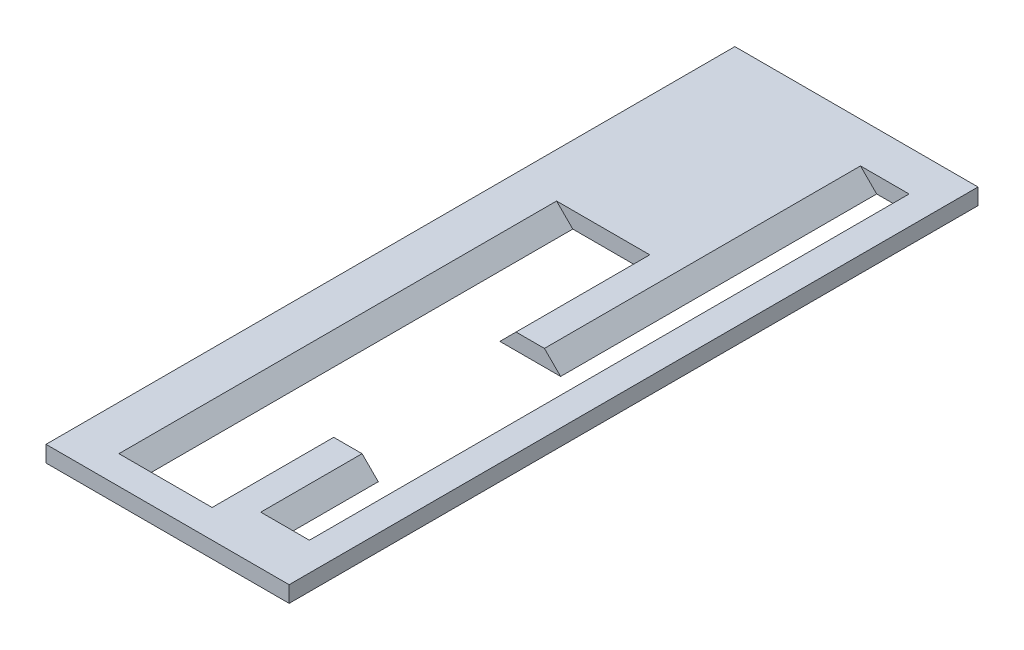
ISO-10303-21;
HEADER;
FILE_DESCRIPTION(('STEP AP214'),'2;1');
FILE_NAME('part.step','',(''),(''),'','','');
FILE_SCHEMA(('AUTOMOTIVE_DESIGN { 1 0 10303 214 1 1 1 1 }'));
ENDSEC;
DATA;
#1=APPLICATION_CONTEXT('core data for automotive mechanical design processes');
#2=APPLICATION_PROTOCOL_DEFINITION('international standard','automotive_design',2000,#1);
#3=PRODUCT_CONTEXT('',#1,'mechanical');
#4=PRODUCT('Part','Part','',(#3));
#5=PRODUCT_RELATED_PRODUCT_CATEGORY('part','',(#4));
#6=PRODUCT_DEFINITION_FORMATION('','',#4);
#7=PRODUCT_DEFINITION_CONTEXT('part definition',#1,'design');
#8=PRODUCT_DEFINITION('design','',#6,#7);
#9=PRODUCT_DEFINITION_SHAPE('','',#8);
#10=(LENGTH_UNIT() NAMED_UNIT(*) SI_UNIT(.MILLI.,.METRE.));
#11=(NAMED_UNIT(*) PLANE_ANGLE_UNIT() SI_UNIT($,.RADIAN.));
#12=(NAMED_UNIT(*) SI_UNIT($,.STERADIAN.) SOLID_ANGLE_UNIT());
#13=UNCERTAINTY_MEASURE_WITH_UNIT(LENGTH_MEASURE(1.E-05),#10,'distance_accuracy_value','');
#14=(GEOMETRIC_REPRESENTATION_CONTEXT(3) GLOBAL_UNCERTAINTY_ASSIGNED_CONTEXT((#13)) GLOBAL_UNIT_ASSIGNED_CONTEXT((#10,
#11,#12)) REPRESENTATION_CONTEXT('',''));
#15=CARTESIAN_POINT('',(0.,0.,0.));
#16=DIRECTION('',(0.,0.,1.));
#17=DIRECTION('',(1.,0.,0.));
#18=AXIS2_PLACEMENT_3D('',#15,#16,#17);
#19=CARTESIAN_POINT('',(4.75000000000001,-4.75,-110.));
#20=DIRECTION('',(-0.707106781186549,0.707106781186546,0.));
#21=DIRECTION('',(-0.707106781186546,-0.707106781186549,0.));
#22=AXIS2_PLACEMENT_3D('',#19,#20,#21);
#23=PLANE('',#22);
#24=DIRECTION('',(0.,0.,1.));
#25=VECTOR('',#24,1.);
#26=CARTESIAN_POINT('',(11.5,2.,-110.));
#27=LINE('',#26,#25);
#28=CARTESIAN_POINT('',(11.5,2.,-32.));
#29=VERTEX_POINT('',#28);
#30=CARTESIAN_POINT('',(11.5,2.,-2.));
#31=VERTEX_POINT('',#30);
#32=EDGE_CURVE('E208',#29,#31,#27,.T.);
#33=ORIENTED_EDGE('',*,*,#32,.F.);
#34=DIRECTION('',(-0.707106781186546,-0.707106781186549,0.));
#35=VECTOR('',#34,1.);
#36=CARTESIAN_POINT('',(4.75000000000001,-4.75,-32.));
#37=LINE('',#36,#35);
#38=CARTESIAN_POINT('',(7.5,-2.,-32.));
#39=VERTEX_POINT('',#38);
#40=EDGE_CURVE('E295',#29,#39,#37,.T.);
#41=ORIENTED_EDGE('',*,*,#40,.T.);
#42=DIRECTION('',(0.,0.,1.));
#43=VECTOR('',#42,1.);
#44=CARTESIAN_POINT('',(7.5,-2.,-110.));
#45=LINE('',#44,#43);
#46=CARTESIAN_POINT('',(7.49999999999999,-2.,-2.));
#47=VERTEX_POINT('',#46);
#48=EDGE_CURVE('E169',#39,#47,#45,.T.);
#49=ORIENTED_EDGE('',*,*,#48,.T.);
#50=DIRECTION('',(-0.707106781186546,-0.707106781186549,0.));
#51=VECTOR('',#50,1.);
#52=CARTESIAN_POINT('',(11.5,2.,-2.));
#53=LINE('',#52,#51);
#54=EDGE_CURVE('E289',#31,#47,#53,.T.);
#55=ORIENTED_EDGE('',*,*,#54,.F.);
#56=EDGE_LOOP('',(#33,#41,#49,#55));
#57=FACE_BOUND('',#56,.T.);
#58=ADVANCED_FACE('F43',(#57),#23,.T.);
#59=CARTESIAN_POINT('',(0.,2.,-110.));
#60=DIRECTION('',(0.,-1.,0.));
#61=DIRECTION('',(0.,0.,-1.));
#62=AXIS2_PLACEMENT_3D('',#59,#60,#61);
#63=PLANE('',#62);
#64=DIRECTION('',(-1.,0.,0.));
#65=VECTOR('',#64,1.);
#66=CARTESIAN_POINT('',(-22.5,2.,5.));
#67=LINE('',#66,#65);
#68=CARTESIAN_POINT('',(37.5,2.,5.));
#69=VERTEX_POINT('',#68);
#70=CARTESIAN_POINT('',(-22.5,2.,5.));
#71=VERTEX_POINT('',#70);
#72=EDGE_CURVE('E216',#69,#71,#67,.T.);
#73=ORIENTED_EDGE('',*,*,#72,.F.);
#74=DIRECTION('',(0.,0.,-1.));
#75=VECTOR('',#74,1.);
#76=CARTESIAN_POINT('',(37.5,2.,0.));
#77=LINE('',#76,#75);
#78=CARTESIAN_POINT('',(37.5,2.,-165.));
#79=VERTEX_POINT('',#78);
#80=EDGE_CURVE('E189',#69,#79,#77,.T.);
#81=ORIENTED_EDGE('',*,*,#80,.T.);
#82=DIRECTION('',(-1.,0.,0.));
#83=VECTOR('',#82,1.);
#84=CARTESIAN_POINT('',(0.,2.,-165.));
#85=LINE('',#84,#83);
#86=CARTESIAN_POINT('',(-22.5,2.,-165.));
#87=VERTEX_POINT('',#86);
#88=EDGE_CURVE('E186',#79,#87,#85,.T.);
#89=ORIENTED_EDGE('',*,*,#88,.T.);
#90=DIRECTION('',(0.,0.,1.));
#91=VECTOR('',#90,1.);
#92=CARTESIAN_POINT('',(-22.5,2.,-110.));
#93=LINE('',#92,#91);
#94=EDGE_CURVE('E228',#87,#71,#93,.T.);
#95=ORIENTED_EDGE('',*,*,#94,.T.);
#96=EDGE_LOOP('',(#73,#81,#89,#95));
#97=FACE_BOUND('',#96,.T.);
#98=CARTESIAN_POINT('',(11.5,2.,-110.));
#99=VERTEX_POINT('',#98);
#100=CARTESIAN_POINT('',(11.5,2.,-77.));
#101=VERTEX_POINT('',#100);
#102=EDGE_CURVE('E213',#99,#101,#27,.T.);
#103=ORIENTED_EDGE('',*,*,#102,.T.);
#104=DIRECTION('',(1.,0.,0.));
#105=VECTOR('',#104,1.);
#106=CARTESIAN_POINT('',(0.,2.,-77.));
#107=LINE('',#106,#105);
#108=CARTESIAN_POINT('',(18.5,2.,-77.));
#109=VERTEX_POINT('',#108);
#110=EDGE_CURVE('E170',#101,#109,#107,.T.);
#111=ORIENTED_EDGE('',*,*,#110,.T.);
#112=DIRECTION('',(0.,0.,-1.));
#113=VECTOR('',#112,1.);
#114=CARTESIAN_POINT('',(18.5,2.,-110.));
#115=LINE('',#114,#113);
#116=CARTESIAN_POINT('',(18.5,2.,-155.));
#117=VERTEX_POINT('',#116);
#118=EDGE_CURVE('E248',#109,#117,#115,.T.);
#119=ORIENTED_EDGE('',*,*,#118,.T.);
#120=DIRECTION('',(-1.,0.,0.));
#121=VECTOR('',#120,1.);
#122=CARTESIAN_POINT('',(22.5,2.,-155.));
#123=LINE('',#122,#121);
#124=CARTESIAN_POINT('',(30.5000000000001,2.,-155.));
#125=VERTEX_POINT('',#124);
#126=EDGE_CURVE('E182',#125,#117,#123,.T.);
#127=ORIENTED_EDGE('',*,*,#126,.F.);
#128=DIRECTION('',(0.,0.,1.));
#129=VECTOR('',#128,1.);
#130=CARTESIAN_POINT('',(30.5000000000001,2.,-110.));
#131=LINE('',#130,#129);
#132=CARTESIAN_POINT('',(30.5000000000001,2.,-7.));
#133=VERTEX_POINT('',#132);
#134=EDGE_CURVE('E245',#125,#133,#131,.T.);
#135=ORIENTED_EDGE('',*,*,#134,.T.);
#136=DIRECTION('',(1.,0.,0.));
#137=VECTOR('',#136,1.);
#138=CARTESIAN_POINT('',(22.5,2.,-7.));
#139=LINE('',#138,#137);
#140=CARTESIAN_POINT('',(18.5,2.,-7.));
#141=VERTEX_POINT('',#140);
#142=EDGE_CURVE('E282',#141,#133,#139,.T.);
#143=ORIENTED_EDGE('',*,*,#142,.F.);
#144=DIRECTION('',(0.,0.,-1.));
#145=VECTOR('',#144,1.);
#146=CARTESIAN_POINT('',(18.5,2.,-110.));
#147=LINE('',#146,#145);
#148=CARTESIAN_POINT('',(18.5,2.,-32.));
#149=VERTEX_POINT('',#148);
#150=EDGE_CURVE('E250',#141,#149,#147,.T.);
#151=ORIENTED_EDGE('',*,*,#150,.T.);
#152=DIRECTION('',(1.,0.,0.));
#153=VECTOR('',#152,1.);
#154=CARTESIAN_POINT('',(0.,2.,-32.));
#155=LINE('',#154,#153);
#156=EDGE_CURVE('E59',#29,#149,#155,.T.);
#157=ORIENTED_EDGE('',*,*,#156,.F.);
#158=ORIENTED_EDGE('',*,*,#32,.T.);
#159=DIRECTION('',(1.,0.,0.));
#160=VECTOR('',#159,1.);
#161=CARTESIAN_POINT('',(-11.5,2.,-2.));
#162=LINE('',#161,#160);
#163=CARTESIAN_POINT('',(-11.5,2.,-2.));
#164=VERTEX_POINT('',#163);
#165=EDGE_CURVE('E292',#164,#31,#162,.T.);
#166=ORIENTED_EDGE('',*,*,#165,.F.);
#167=DIRECTION('',(0.,0.,1.));
#168=VECTOR('',#167,1.);
#169=CARTESIAN_POINT('',(-11.5,2.,-110.));
#170=LINE('',#169,#168);
#171=CARTESIAN_POINT('',(-11.5,2.,-110.));
#172=VERTEX_POINT('',#171);
#173=EDGE_CURVE('E231',#172,#164,#170,.T.);
#174=ORIENTED_EDGE('',*,*,#173,.F.);
#175=DIRECTION('',(-1.,0.,0.));
#176=VECTOR('',#175,1.);
#177=CARTESIAN_POINT('',(-22.5,2.,-110.));
#178=LINE('',#177,#176);
#179=EDGE_CURVE('E196',#99,#172,#178,.T.);
#180=ORIENTED_EDGE('',*,*,#179,.F.);
#181=EDGE_LOOP('',(#103,#111,#119,#127,#135,#143,#151,#157,#158,#166,#174,#180));
#182=FACE_BOUND('',#181,.T.);
#183=ADVANCED_FACE('F267',(#97,#182),#63,.F.);
#184=CARTESIAN_POINT('',(0.,-2.,-110.));
#185=DIRECTION('',(0.,-1.,0.));
#186=DIRECTION('',(0.,0.,-1.));
#187=AXIS2_PLACEMENT_3D('',#184,#185,#186);
#188=PLANE('',#187);
#189=DIRECTION('',(1.,0.,0.));
#190=VECTOR('',#189,1.);
#191=CARTESIAN_POINT('',(7.50000000000001,-2.,-77.));
#192=LINE('',#191,#190);
#193=CARTESIAN_POINT('',(7.50000000000001,-2.,-77.));
#194=VERTEX_POINT('',#193);
#195=CARTESIAN_POINT('',(22.5,-2.,-77.));
#196=VERTEX_POINT('',#195);
#197=EDGE_CURVE('E66',#194,#196,#192,.T.);
#198=ORIENTED_EDGE('',*,*,#197,.F.);
#199=CARTESIAN_POINT('',(7.49999999999999,-2.,-110.));
#200=VERTEX_POINT('',#199);
#201=EDGE_CURVE('E209',#200,#194,#45,.T.);
#202=ORIENTED_EDGE('',*,*,#201,.F.);
#203=DIRECTION('',(-1.,0.,0.));
#204=VECTOR('',#203,1.);
#205=CARTESIAN_POINT('',(-22.5,-2.,-110.));
#206=LINE('',#205,#204);
#207=CARTESIAN_POINT('',(-7.5,-2.,-110.));
#208=VERTEX_POINT('',#207);
#209=EDGE_CURVE('E202',#200,#208,#206,.T.);
#210=ORIENTED_EDGE('',*,*,#209,.T.);
#211=DIRECTION('',(0.,0.,1.));
#212=VECTOR('',#211,1.);
#213=CARTESIAN_POINT('',(-7.5,-2.,-110.));
#214=LINE('',#213,#212);
#215=CARTESIAN_POINT('',(-7.5,-2.,-2.));
#216=VERTEX_POINT('',#215);
#217=EDGE_CURVE('E234',#208,#216,#214,.T.);
#218=ORIENTED_EDGE('',*,*,#217,.T.);
#219=DIRECTION('',(-1.,0.,0.));
#220=VECTOR('',#219,1.);
#221=CARTESIAN_POINT('',(7.49999999999999,-2.,-2.));
#222=LINE('',#221,#220);
#223=EDGE_CURVE('E285',#47,#216,#222,.T.);
#224=ORIENTED_EDGE('',*,*,#223,.F.);
#225=ORIENTED_EDGE('',*,*,#48,.F.);
#226=DIRECTION('',(1.,0.,0.));
#227=VECTOR('',#226,1.);
#228=CARTESIAN_POINT('',(7.5,-2.,-32.));
#229=LINE('',#228,#227);
#230=CARTESIAN_POINT('',(22.5,-2.,-32.));
#231=VERTEX_POINT('',#230);
#232=EDGE_CURVE('E155',#39,#231,#229,.T.);
#233=ORIENTED_EDGE('',*,*,#232,.T.);
#234=DIRECTION('',(0.,0.,-1.));
#235=VECTOR('',#234,1.);
#236=CARTESIAN_POINT('',(22.5,-2.,-110.));
#237=LINE('',#236,#235);
#238=CARTESIAN_POINT('',(22.5,-2.,-7.));
#239=VERTEX_POINT('',#238);
#240=EDGE_CURVE('E167',#239,#231,#237,.T.);
#241=ORIENTED_EDGE('',*,*,#240,.F.);
#242=DIRECTION('',(-1.,0.,0.));
#243=VECTOR('',#242,1.);
#244=CARTESIAN_POINT('',(0.,-2.,-7.00000000000001));
#245=LINE('',#244,#243);
#246=CARTESIAN_POINT('',(26.5,-2.,-7.));
#247=VERTEX_POINT('',#246);
#248=EDGE_CURVE('E230',#247,#239,#245,.T.);
#249=ORIENTED_EDGE('',*,*,#248,.F.);
#250=DIRECTION('',(0.,0.,1.));
#251=VECTOR('',#250,1.);
#252=CARTESIAN_POINT('',(26.5,-2.,-110.));
#253=LINE('',#252,#251);
#254=CARTESIAN_POINT('',(26.5,-2.,-155.));
#255=VERTEX_POINT('',#254);
#256=EDGE_CURVE('E239',#255,#247,#253,.T.);
#257=ORIENTED_EDGE('',*,*,#256,.F.);
#258=DIRECTION('',(1.,0.,0.));
#259=VECTOR('',#258,1.);
#260=CARTESIAN_POINT('',(0.,-2.,-155.));
#261=LINE('',#260,#259);
#262=CARTESIAN_POINT('',(22.5,-2.,-155.));
#263=VERTEX_POINT('',#262);
#264=EDGE_CURVE('E242',#263,#255,#261,.T.);
#265=ORIENTED_EDGE('',*,*,#264,.F.);
#266=EDGE_CURVE('E177',#196,#263,#237,.T.);
#267=ORIENTED_EDGE('',*,*,#266,.F.);
#268=EDGE_LOOP('',(#198,#202,#210,#218,#224,#225,#233,#241,#249,#257,#265,#267));
#269=FACE_BOUND('',#268,.T.);
#270=DIRECTION('',(0.,0.,-1.));
#271=VECTOR('',#270,1.);
#272=CARTESIAN_POINT('',(37.5,-2.,0.));
#273=LINE('',#272,#271);
#274=CARTESIAN_POINT('',(37.5,-2.,5.));
#275=VERTEX_POINT('',#274);
#276=CARTESIAN_POINT('',(37.5,-2.,-165.));
#277=VERTEX_POINT('',#276);
#278=EDGE_CURVE('E180',#275,#277,#273,.T.);
#279=ORIENTED_EDGE('',*,*,#278,.F.);
#280=DIRECTION('',(-1.,0.,0.));
#281=VECTOR('',#280,1.);
#282=CARTESIAN_POINT('',(-22.5,-2.,5.));
#283=LINE('',#282,#281);
#284=CARTESIAN_POINT('',(-22.5,-2.,5.));
#285=VERTEX_POINT('',#284);
#286=EDGE_CURVE('E212',#275,#285,#283,.T.);
#287=ORIENTED_EDGE('',*,*,#286,.T.);
#288=DIRECTION('',(0.,0.,1.));
#289=VECTOR('',#288,1.);
#290=CARTESIAN_POINT('',(-22.5,-2.,-110.));
#291=LINE('',#290,#289);
#292=CARTESIAN_POINT('',(-22.5,-2.,-165.));
#293=VERTEX_POINT('',#292);
#294=EDGE_CURVE('E227',#293,#285,#291,.T.);
#295=ORIENTED_EDGE('',*,*,#294,.F.);
#296=DIRECTION('',(-1.,0.,0.));
#297=VECTOR('',#296,1.);
#298=CARTESIAN_POINT('',(0.,-2.,-165.));
#299=LINE('',#298,#297);
#300=EDGE_CURVE('E176',#277,#293,#299,.T.);
#301=ORIENTED_EDGE('',*,*,#300,.F.);
#302=EDGE_LOOP('',(#279,#287,#295,#301));
#303=FACE_BOUND('',#302,.T.);
#304=ADVANCED_FACE('F164',(#269,#303),#188,.T.);
#305=CARTESIAN_POINT('',(22.5,-2.00000000000003,-155.));
#306=DIRECTION('',(-0.707106781186547,-0.707106781186548,0.));
#307=DIRECTION('',(0.,0.,1.));
#308=AXIS2_PLACEMENT_3D('',#305,#306,#307);
#309=PLANE('',#308);
#310=ORIENTED_EDGE('',*,*,#240,.T.);
#311=DIRECTION('',(0.707106781186548,-0.707106781186547,0.));
#312=VECTOR('',#311,1.);
#313=CARTESIAN_POINT('',(22.5,-2.00000000000003,-32.));
#314=LINE('',#313,#312);
#315=EDGE_CURVE('E11',#231,#149,#314,.F.);
#316=ORIENTED_EDGE('',*,*,#315,.T.);
#317=ORIENTED_EDGE('',*,*,#150,.F.);
#318=DIRECTION('',(0.707106781186548,-0.707106781186547,0.));
#319=VECTOR('',#318,1.);
#320=CARTESIAN_POINT('',(25.5,-5.00000000000002,-7.));
#321=LINE('',#320,#319);
#322=EDGE_CURVE('E174',#239,#141,#321,.F.);
#323=ORIENTED_EDGE('',*,*,#322,.F.);
#324=EDGE_LOOP('',(#310,#316,#317,#323));
#325=FACE_BOUND('',#324,.T.);
#326=ADVANCED_FACE('F172',(#325),#309,.F.);
#327=CARTESIAN_POINT('',(-22.5,0.,-110.));
#328=DIRECTION('',(-1.,0.,0.));
#329=DIRECTION('',(0.,0.,1.));
#330=AXIS2_PLACEMENT_3D('',#327,#328,#329);
#331=PLANE('',#330);
#332=ORIENTED_EDGE('',*,*,#294,.T.);
#333=DIRECTION('',(0.,-1.,0.));
#334=VECTOR('',#333,1.);
#335=CARTESIAN_POINT('',(-22.5,2.,5.));
#336=LINE('',#335,#334);
#337=EDGE_CURVE('E219',#71,#285,#336,.T.);
#338=ORIENTED_EDGE('',*,*,#337,.F.);
#339=ORIENTED_EDGE('',*,*,#94,.F.);
#340=DIRECTION('',(0.,-1.,0.));
#341=VECTOR('',#340,1.);
#342=CARTESIAN_POINT('',(-22.5,2.,-165.));
#343=LINE('',#342,#341);
#344=EDGE_CURVE('E190',#87,#293,#343,.T.);
#345=ORIENTED_EDGE('',*,*,#344,.T.);
#346=EDGE_LOOP('',(#332,#338,#339,#345));
#347=FACE_BOUND('',#346,.T.);
#348=ADVANCED_FACE('F341',(#347),#331,.T.);
#349=CARTESIAN_POINT('',(-4.75000000000001,-4.74999999999999,-110.));
#350=DIRECTION('',(-0.707106781186549,-0.707106781186546,0.));
#351=DIRECTION('',(0.707106781186546,-0.707106781186549,0.));
#352=AXIS2_PLACEMENT_3D('',#349,#350,#351);
#353=PLANE('',#352);
#354=ORIENTED_EDGE('',*,*,#173,.T.);
#355=DIRECTION('',(-0.707106781186547,0.707106781186548,0.));
#356=VECTOR('',#355,1.);
#357=CARTESIAN_POINT('',(-7.5,-2.,-2.));
#358=LINE('',#357,#356);
#359=EDGE_CURVE('E283',#216,#164,#358,.T.);
#360=ORIENTED_EDGE('',*,*,#359,.F.);
#361=ORIENTED_EDGE('',*,*,#217,.F.);
#362=DIRECTION('',(0.707106781186546,-0.707106781186549,0.));
#363=VECTOR('',#362,1.);
#364=CARTESIAN_POINT('',(-4.75000000000001,-4.74999999999999,-110.));
#365=LINE('',#364,#363);
#366=EDGE_CURVE('E224',#172,#208,#365,.T.);
#367=ORIENTED_EDGE('',*,*,#366,.F.);
#368=EDGE_LOOP('',(#354,#360,#361,#367));
#369=FACE_BOUND('',#368,.T.);
#370=ADVANCED_FACE('F310',(#369),#353,.F.);
#371=CARTESIAN_POINT('',(-22.5,2.,5.));
#372=DIRECTION('',(0.,0.,1.));
#373=DIRECTION('',(1.,0.,0.));
#374=AXIS2_PLACEMENT_3D('',#371,#372,#373);
#375=PLANE('',#374);
#376=ORIENTED_EDGE('',*,*,#286,.F.);
#377=DIRECTION('',(0.,-1.,0.));
#378=VECTOR('',#377,1.);
#379=CARTESIAN_POINT('',(37.5,2.,5.));
#380=LINE('',#379,#378);
#381=EDGE_CURVE('E193',#69,#275,#380,.T.);
#382=ORIENTED_EDGE('',*,*,#381,.F.);
#383=ORIENTED_EDGE('',*,*,#72,.T.);
#384=ORIENTED_EDGE('',*,*,#337,.T.);
#385=EDGE_LOOP('',(#376,#382,#383,#384));
#386=FACE_BOUND('',#385,.T.);
#387=ADVANCED_FACE('F327',(#386),#375,.T.);
#388=DIRECTION('',(-0.707106781186546,-0.707106781186549,0.));
#389=VECTOR('',#388,1.);
#390=CARTESIAN_POINT('',(4.75000000000001,-4.75,-77.));
#391=LINE('',#390,#389);
#392=EDGE_CURVE('E271',#101,#194,#391,.T.);
#393=ORIENTED_EDGE('',*,*,#392,.F.);
#394=ORIENTED_EDGE('',*,*,#102,.F.);
#395=DIRECTION('',(-0.707106781186546,-0.707106781186549,0.));
#396=VECTOR('',#395,1.);
#397=CARTESIAN_POINT('',(4.75000000000001,-4.75,-110.));
#398=LINE('',#397,#396);
#399=EDGE_CURVE('E204',#99,#200,#398,.T.);
#400=ORIENTED_EDGE('',*,*,#399,.T.);
#401=ORIENTED_EDGE('',*,*,#201,.T.);
#402=EDGE_LOOP('',(#393,#394,#400,#401));
#403=FACE_BOUND('',#402,.T.);
#404=ADVANCED_FACE('F301',(#403),#23,.T.);
#405=CARTESIAN_POINT('',(-22.5,2.,-110.));
#406=DIRECTION('',(0.,0.,1.));
#407=DIRECTION('',(1.,0.,0.));
#408=AXIS2_PLACEMENT_3D('',#405,#406,#407);
#409=PLANE('',#408);
#410=ORIENTED_EDGE('',*,*,#366,.T.);
#411=ORIENTED_EDGE('',*,*,#209,.F.);
#412=ORIENTED_EDGE('',*,*,#399,.F.);
#413=ORIENTED_EDGE('',*,*,#179,.T.);
#414=EDGE_LOOP('',(#410,#411,#412,#413));
#415=FACE_BOUND('',#414,.T.);
#416=ADVANCED_FACE('F303',(#415),#409,.T.);
#417=CARTESIAN_POINT('',(37.5,2.,0.));
#418=DIRECTION('',(-1.,0.,0.));
#419=DIRECTION('',(0.,0.,1.));
#420=AXIS2_PLACEMENT_3D('',#417,#418,#419);
#421=PLANE('',#420);
#422=ORIENTED_EDGE('',*,*,#278,.T.);
#423=DIRECTION('',(0.,-1.,0.));
#424=VECTOR('',#423,1.);
#425=CARTESIAN_POINT('',(37.5,2.,-165.));
#426=LINE('',#425,#424);
#427=EDGE_CURVE('E197',#79,#277,#426,.T.);
#428=ORIENTED_EDGE('',*,*,#427,.F.);
#429=ORIENTED_EDGE('',*,*,#80,.F.);
#430=ORIENTED_EDGE('',*,*,#381,.T.);
#431=EDGE_LOOP('',(#422,#428,#429,#430));
#432=FACE_BOUND('',#431,.T.);
#433=ADVANCED_FACE('F333',(#432),#421,.F.);
#434=CARTESIAN_POINT('',(0.,2.,-165.));
#435=DIRECTION('',(0.,0.,1.));
#436=DIRECTION('',(1.,0.,0.));
#437=AXIS2_PLACEMENT_3D('',#434,#435,#436);
#438=PLANE('',#437);
#439=ORIENTED_EDGE('',*,*,#300,.T.);
#440=ORIENTED_EDGE('',*,*,#344,.F.);
#441=ORIENTED_EDGE('',*,*,#88,.F.);
#442=ORIENTED_EDGE('',*,*,#427,.T.);
#443=EDGE_LOOP('',(#439,#440,#441,#442));
#444=FACE_BOUND('',#443,.T.);
#445=ADVANCED_FACE('F364',(#444),#438,.F.);
#446=CARTESIAN_POINT('',(22.5,-8.,-155.));
#447=DIRECTION('',(0.,0.,-1.));
#448=DIRECTION('',(-1.,0.,0.));
#449=AXIS2_PLACEMENT_3D('',#446,#447,#448);
#450=PLANE('',#449);
#451=ORIENTED_EDGE('',*,*,#264,.T.);
#452=DIRECTION('',(-0.707106781186547,-0.707106781186548,0.));
#453=VECTOR('',#452,1.);
#454=CARTESIAN_POINT('',(21.5,-7.00000000000003,-155.));
#455=LINE('',#454,#453);
#456=EDGE_CURVE('E256',#255,#125,#455,.F.);
#457=ORIENTED_EDGE('',*,*,#456,.T.);
#458=ORIENTED_EDGE('',*,*,#126,.T.);
#459=DIRECTION('',(-0.707106781186548,0.707106781186547,0.));
#460=VECTOR('',#459,1.);
#461=CARTESIAN_POINT('',(25.5,-5.00000000000002,-155.));
#462=LINE('',#461,#460);
#463=EDGE_CURVE('E253',#117,#263,#462,.F.);
#464=ORIENTED_EDGE('',*,*,#463,.T.);
#465=EDGE_LOOP('',(#451,#457,#458,#464));
#466=FACE_BOUND('',#465,.T.);
#467=ADVANCED_FACE('F277',(#466),#450,.F.);
#468=CARTESIAN_POINT('',(22.5,-8.,-7.));
#469=DIRECTION('',(0.,0.,1.));
#470=DIRECTION('',(1.,0.,0.));
#471=AXIS2_PLACEMENT_3D('',#468,#469,#470);
#472=PLANE('',#471);
#473=ORIENTED_EDGE('',*,*,#248,.T.);
#474=ORIENTED_EDGE('',*,*,#322,.T.);
#475=ORIENTED_EDGE('',*,*,#142,.T.);
#476=DIRECTION('',(0.707106781186547,0.707106781186548,0.));
#477=VECTOR('',#476,1.);
#478=CARTESIAN_POINT('',(21.5,-7.00000000000003,-7.));
#479=LINE('',#478,#477);
#480=EDGE_CURVE('E259',#133,#247,#479,.F.);
#481=ORIENTED_EDGE('',*,*,#480,.T.);
#482=EDGE_LOOP('',(#473,#474,#475,#481));
#483=FACE_BOUND('',#482,.T.);
#484=ADVANCED_FACE('F354',(#483),#472,.F.);
#485=CARTESIAN_POINT('',(22.5,-2.00000000000003,-155.));
#486=DIRECTION('',(-0.707106781186547,-0.707106781186548,0.));
#487=DIRECTION('',(0.,0.,1.));
#488=AXIS2_PLACEMENT_3D('',#485,#486,#487);
#489=PLANE('',#488);
#490=DIRECTION('',(0.707106781186548,-0.707106781186547,0.));
#491=VECTOR('',#490,1.);
#492=CARTESIAN_POINT('',(22.5,-2.00000000000003,-77.));
#493=LINE('',#492,#491);
#494=EDGE_CURVE('E52',#196,#109,#493,.F.);
#495=ORIENTED_EDGE('',*,*,#494,.F.);
#496=ORIENTED_EDGE('',*,*,#266,.T.);
#497=ORIENTED_EDGE('',*,*,#463,.F.);
#498=ORIENTED_EDGE('',*,*,#118,.F.);
#499=EDGE_LOOP('',(#495,#496,#497,#498));
#500=FACE_BOUND('',#499,.T.);
#501=ADVANCED_FACE('F274',(#500),#489,.F.);
#502=CARTESIAN_POINT('',(26.5,-2.00000000000006,-155.));
#503=DIRECTION('',(0.707106781186548,-0.707106781186547,0.));
#504=DIRECTION('',(0.,0.,-1.));
#505=AXIS2_PLACEMENT_3D('',#502,#503,#504);
#506=PLANE('',#505);
#507=ORIENTED_EDGE('',*,*,#480,.F.);
#508=ORIENTED_EDGE('',*,*,#134,.F.);
#509=ORIENTED_EDGE('',*,*,#456,.F.);
#510=ORIENTED_EDGE('',*,*,#256,.T.);
#511=EDGE_LOOP('',(#507,#508,#509,#510));
#512=FACE_BOUND('',#511,.T.);
#513=ADVANCED_FACE('F46',(#512),#506,.F.);
#514=CARTESIAN_POINT('',(0.,0.,-2.));
#515=DIRECTION('',(0.,0.,-1.));
#516=DIRECTION('',(-1.,0.,0.));
#517=AXIS2_PLACEMENT_3D('',#514,#515,#516);
#518=PLANE('',#517);
#519=ORIENTED_EDGE('',*,*,#165,.T.);
#520=ORIENTED_EDGE('',*,*,#54,.T.);
#521=ORIENTED_EDGE('',*,*,#223,.T.);
#522=ORIENTED_EDGE('',*,*,#359,.T.);
#523=EDGE_LOOP('',(#519,#520,#521,#522));
#524=FACE_BOUND('',#523,.T.);
#525=ADVANCED_FACE('F312',(#524),#518,.T.);
#526=CARTESIAN_POINT('',(7.50000000000001,78.,-77.));
#527=DIRECTION('',(0.,0.,-1.));
#528=DIRECTION('',(-1.,0.,0.));
#529=AXIS2_PLACEMENT_3D('',#526,#527,#528);
#530=PLANE('',#529);
#531=ORIENTED_EDGE('',*,*,#392,.T.);
#532=ORIENTED_EDGE('',*,*,#197,.T.);
#533=ORIENTED_EDGE('',*,*,#494,.T.);
#534=ORIENTED_EDGE('',*,*,#110,.F.);
#535=EDGE_LOOP('',(#531,#532,#533,#534));
#536=FACE_BOUND('',#535,.T.);
#537=ADVANCED_FACE('F261',(#536),#530,.F.);
#538=CARTESIAN_POINT('',(7.5,78.,-32.));
#539=DIRECTION('',(0.,0.,-1.));
#540=DIRECTION('',(-1.,0.,0.));
#541=AXIS2_PLACEMENT_3D('',#538,#539,#540);
#542=PLANE('',#541);
#543=ORIENTED_EDGE('',*,*,#156,.T.);
#544=ORIENTED_EDGE('',*,*,#315,.F.);
#545=ORIENTED_EDGE('',*,*,#232,.F.);
#546=ORIENTED_EDGE('',*,*,#40,.F.);
#547=EDGE_LOOP('',(#543,#544,#545,#546));
#548=FACE_BOUND('',#547,.T.);
#549=ADVANCED_FACE('F154',(#548),#542,.T.);
#550=CLOSED_SHELL('',(#58,#183,#304,#326,#348,#370,#387,#404,#416,#433,#445,#467,#484,#501,#513,
#525,#537,#549));
#551=MANIFOLD_SOLID_BREP('B2',#550);
#552=ADVANCED_BREP_SHAPE_REPRESENTATION('',(#18,#551),#14);
#553=SHAPE_DEFINITION_REPRESENTATION(#9,#552);
ENDSEC;
END-ISO-10303-21;
